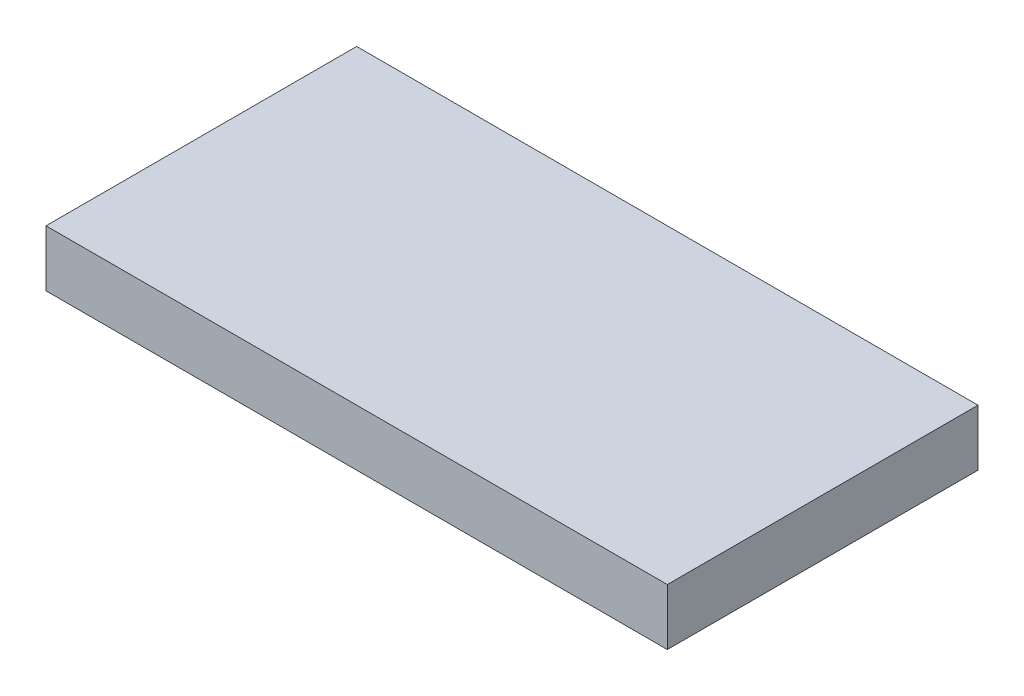
ISO-10303-21;
HEADER;
FILE_DESCRIPTION(('STEP AP214'),'2;1');
FILE_NAME('part.step','',(''),(''),'','','');
FILE_SCHEMA(('AUTOMOTIVE_DESIGN { 1 0 10303 214 1 1 1 1 }'));
ENDSEC;
DATA;
#1=APPLICATION_CONTEXT('core data for automotive mechanical design processes');
#2=APPLICATION_PROTOCOL_DEFINITION('international standard','automotive_design',2000,#1);
#3=PRODUCT_CONTEXT('',#1,'mechanical');
#4=PRODUCT('Part','Part','',(#3));
#5=PRODUCT_RELATED_PRODUCT_CATEGORY('part','',(#4));
#6=PRODUCT_DEFINITION_FORMATION('','',#4);
#7=PRODUCT_DEFINITION_CONTEXT('part definition',#1,'design');
#8=PRODUCT_DEFINITION('design','',#6,#7);
#9=PRODUCT_DEFINITION_SHAPE('','',#8);
#10=(LENGTH_UNIT() NAMED_UNIT(*) SI_UNIT(.MILLI.,.METRE.));
#11=(NAMED_UNIT(*) PLANE_ANGLE_UNIT() SI_UNIT($,.RADIAN.));
#12=(NAMED_UNIT(*) SI_UNIT($,.STERADIAN.) SOLID_ANGLE_UNIT());
#13=UNCERTAINTY_MEASURE_WITH_UNIT(LENGTH_MEASURE(1.E-05),#10,'distance_accuracy_value','');
#14=(GEOMETRIC_REPRESENTATION_CONTEXT(3) GLOBAL_UNCERTAINTY_ASSIGNED_CONTEXT((#13)) GLOBAL_UNIT_ASSIGNED_CONTEXT((#10,
#11,#12)) REPRESENTATION_CONTEXT('',''));
#15=CARTESIAN_POINT('',(0.,0.,0.));
#16=DIRECTION('',(0.,0.,1.));
#17=DIRECTION('',(1.,0.,0.));
#18=AXIS2_PLACEMENT_3D('',#15,#16,#17);
#19=CARTESIAN_POINT('',(0.,14.5,-80.));
#20=DIRECTION('',(0.,0.,-1.));
#21=DIRECTION('',(-1.,0.,0.));
#22=AXIS2_PLACEMENT_3D('',#19,#20,#21);
#23=PLANE('',#22);
#24=DIRECTION('',(1.,0.,0.));
#25=VECTOR('',#24,1.);
#26=CARTESIAN_POINT('',(0.,0.,-80.));
#27=LINE('',#26,#25);
#28=CARTESIAN_POINT('',(-80.,0.,-80.));
#29=VERTEX_POINT('',#28);
#30=CARTESIAN_POINT('',(80.,0.,-80.));
#31=VERTEX_POINT('',#30);
#32=EDGE_CURVE('E112',#29,#31,#27,.T.);
#33=ORIENTED_EDGE('',*,*,#32,.F.);
#34=DIRECTION('',(0.,-1.,0.));
#35=VECTOR('',#34,1.);
#36=CARTESIAN_POINT('',(-80.,14.5,-80.));
#37=LINE('',#36,#35);
#38=CARTESIAN_POINT('',(-80.,14.5,-80.));
#39=VERTEX_POINT('',#38);
#40=EDGE_CURVE('E115',#39,#29,#37,.T.);
#41=ORIENTED_EDGE('',*,*,#40,.F.);
#42=DIRECTION('',(1.,0.,0.));
#43=VECTOR('',#42,1.);
#44=CARTESIAN_POINT('',(0.,14.5,-80.));
#45=LINE('',#44,#43);
#46=CARTESIAN_POINT('',(80.,14.5,-80.));
#47=VERTEX_POINT('',#46);
#48=EDGE_CURVE('E134',#39,#47,#45,.T.);
#49=ORIENTED_EDGE('',*,*,#48,.T.);
#50=DIRECTION('',(0.,-1.,0.));
#51=VECTOR('',#50,1.);
#52=CARTESIAN_POINT('',(80.,14.5,-80.));
#53=LINE('',#52,#51);
#54=EDGE_CURVE('E78',#47,#31,#53,.T.);
#55=ORIENTED_EDGE('',*,*,#54,.T.);
#56=EDGE_LOOP('',(#33,#41,#49,#55));
#57=FACE_BOUND('',#56,.T.);
#58=ADVANCED_FACE('F68',(#57),#23,.T.);
#59=CARTESIAN_POINT('',(0.,0.,0.));
#60=DIRECTION('',(0.,1.,0.));
#61=DIRECTION('',(0.,0.,1.));
#62=AXIS2_PLACEMENT_3D('',#59,#60,#61);
#63=PLANE('',#62);
#64=CARTESIAN_POINT('',(-30.,0.,-15.));
#65=DIRECTION('',(0.,-1.,0.));
#66=DIRECTION('',(0.,0.,-1.));
#67=AXIS2_PLACEMENT_3D('',#64,#65,#66);
#68=CIRCLE('',#67,2.);
#69=CARTESIAN_POINT('',(-30.,0.,-17.));
#70=VERTEX_POINT('',#69);
#71=EDGE_CURVE('E131',#70,#70,#68,.T.);
#72=ORIENTED_EDGE('',*,*,#71,.F.);
#73=EDGE_LOOP('',(#72));
#74=FACE_BOUND('',#73,.T.);
#75=CARTESIAN_POINT('',(30.,0.,-15.));
#76=DIRECTION('',(0.,-1.,0.));
#77=DIRECTION('',(0.,0.,-1.));
#78=AXIS2_PLACEMENT_3D('',#75,#76,#77);
#79=CIRCLE('',#78,2.);
#80=CARTESIAN_POINT('',(30.,0.,-17.));
#81=VERTEX_POINT('',#80);
#82=EDGE_CURVE('E142',#81,#81,#79,.T.);
#83=ORIENTED_EDGE('',*,*,#82,.F.);
#84=EDGE_LOOP('',(#83));
#85=FACE_BOUND('',#84,.T.);
#86=DIRECTION('',(-1.,0.,0.));
#87=VECTOR('',#86,1.);
#88=CARTESIAN_POINT('',(0.,0.,0.));
#89=LINE('',#88,#87);
#90=CARTESIAN_POINT('',(80.,0.,0.));
#91=VERTEX_POINT('',#90);
#92=CARTESIAN_POINT('',(-80.,0.,0.));
#93=VERTEX_POINT('',#92);
#94=EDGE_CURVE('E106',#91,#93,#89,.T.);
#95=ORIENTED_EDGE('',*,*,#94,.T.);
#96=DIRECTION('',(0.,0.,-1.));
#97=VECTOR('',#96,1.);
#98=CARTESIAN_POINT('',(-80.,0.,0.));
#99=LINE('',#98,#97);
#100=EDGE_CURVE('E123',#93,#29,#99,.T.);
#101=ORIENTED_EDGE('',*,*,#100,.T.);
#102=ORIENTED_EDGE('',*,*,#32,.T.);
#103=DIRECTION('',(0.,0.,1.));
#104=VECTOR('',#103,1.);
#105=CARTESIAN_POINT('',(80.,0.,0.));
#106=LINE('',#105,#104);
#107=EDGE_CURVE('E118',#31,#91,#106,.T.);
#108=ORIENTED_EDGE('',*,*,#107,.T.);
#109=EDGE_LOOP('',(#95,#101,#102,#108));
#110=FACE_BOUND('',#109,.T.);
#111=ADVANCED_FACE('F126',(#74,#85,#110),#63,.F.);
#112=CARTESIAN_POINT('',(80.,14.5,0.));
#113=DIRECTION('',(1.,0.,0.));
#114=DIRECTION('',(0.,0.,-1.));
#115=AXIS2_PLACEMENT_3D('',#112,#113,#114);
#116=PLANE('',#115);
#117=ORIENTED_EDGE('',*,*,#107,.F.);
#118=ORIENTED_EDGE('',*,*,#54,.F.);
#119=DIRECTION('',(0.,0.,1.));
#120=VECTOR('',#119,1.);
#121=CARTESIAN_POINT('',(80.,14.5,0.));
#122=LINE('',#121,#120);
#123=CARTESIAN_POINT('',(80.,14.5,0.));
#124=VERTEX_POINT('',#123);
#125=EDGE_CURVE('E139',#47,#124,#122,.T.);
#126=ORIENTED_EDGE('',*,*,#125,.T.);
#127=DIRECTION('',(0.,-1.,0.));
#128=VECTOR('',#127,1.);
#129=CARTESIAN_POINT('',(80.,14.5,0.));
#130=LINE('',#129,#128);
#131=EDGE_CURVE('E12',#124,#91,#130,.T.);
#132=ORIENTED_EDGE('',*,*,#131,.T.);
#133=EDGE_LOOP('',(#117,#118,#126,#132));
#134=FACE_BOUND('',#133,.T.);
#135=ADVANCED_FACE('F155',(#134),#116,.T.);
#136=CARTESIAN_POINT('',(0.,14.5,0.));
#137=DIRECTION('',(0.,0.,1.));
#138=DIRECTION('',(1.,0.,0.));
#139=AXIS2_PLACEMENT_3D('',#136,#137,#138);
#140=PLANE('',#139);
#141=ORIENTED_EDGE('',*,*,#94,.F.);
#142=ORIENTED_EDGE('',*,*,#131,.F.);
#143=DIRECTION('',(-1.,0.,0.));
#144=VECTOR('',#143,1.);
#145=CARTESIAN_POINT('',(0.,14.5,0.));
#146=LINE('',#145,#144);
#147=CARTESIAN_POINT('',(-80.,14.5,0.));
#148=VERTEX_POINT('',#147);
#149=EDGE_CURVE('E117',#124,#148,#146,.T.);
#150=ORIENTED_EDGE('',*,*,#149,.T.);
#151=DIRECTION('',(0.,-1.,0.));
#152=VECTOR('',#151,1.);
#153=CARTESIAN_POINT('',(-80.,14.5,0.));
#154=LINE('',#153,#152);
#155=EDGE_CURVE('E72',#148,#93,#154,.T.);
#156=ORIENTED_EDGE('',*,*,#155,.T.);
#157=EDGE_LOOP('',(#141,#142,#150,#156));
#158=FACE_BOUND('',#157,.T.);
#159=ADVANCED_FACE('F175',(#158),#140,.T.);
#160=CARTESIAN_POINT('',(0.,14.5,0.));
#161=DIRECTION('',(0.,1.,0.));
#162=DIRECTION('',(0.,0.,1.));
#163=AXIS2_PLACEMENT_3D('',#160,#161,#162);
#164=PLANE('',#163);
#165=ORIENTED_EDGE('',*,*,#149,.F.);
#166=ORIENTED_EDGE('',*,*,#125,.F.);
#167=ORIENTED_EDGE('',*,*,#48,.F.);
#168=DIRECTION('',(0.,0.,-1.));
#169=VECTOR('',#168,1.);
#170=CARTESIAN_POINT('',(-80.,14.5,0.));
#171=LINE('',#170,#169);
#172=EDGE_CURVE('E125',#148,#39,#171,.T.);
#173=ORIENTED_EDGE('',*,*,#172,.F.);
#174=EDGE_LOOP('',(#165,#166,#167,#173));
#175=FACE_BOUND('',#174,.T.);
#176=ADVANCED_FACE('F170',(#175),#164,.T.);
#177=CARTESIAN_POINT('',(-80.,14.5,0.));
#178=DIRECTION('',(-1.,0.,0.));
#179=DIRECTION('',(0.,0.,1.));
#180=AXIS2_PLACEMENT_3D('',#177,#178,#179);
#181=PLANE('',#180);
#182=ORIENTED_EDGE('',*,*,#100,.F.);
#183=ORIENTED_EDGE('',*,*,#155,.F.);
#184=ORIENTED_EDGE('',*,*,#172,.T.);
#185=ORIENTED_EDGE('',*,*,#40,.T.);
#186=EDGE_LOOP('',(#182,#183,#184,#185));
#187=FACE_BOUND('',#186,.T.);
#188=ADVANCED_FACE('F70',(#187),#181,.T.);
#189=CARTESIAN_POINT('',(30.,10.,-15.));
#190=DIRECTION('',(0.,-1.,0.));
#191=DIRECTION('',(0.,0.,-1.));
#192=AXIS2_PLACEMENT_3D('',#189,#190,#191);
#193=CYLINDRICAL_SURFACE('',#192,2.);
#194=CARTESIAN_POINT('',(30.,10.,-15.));
#195=DIRECTION('',(0.,-1.,0.));
#196=DIRECTION('',(0.,0.,-1.));
#197=AXIS2_PLACEMENT_3D('',#194,#195,#196);
#198=CIRCLE('',#197,2.);
#199=CARTESIAN_POINT('',(30.,10.,-17.));
#200=VERTEX_POINT('',#199);
#201=EDGE_CURVE('E145',#200,#200,#198,.T.);
#202=ORIENTED_EDGE('',*,*,#201,.F.);
#203=EDGE_LOOP('',(#202));
#204=FACE_BOUND('',#203,.T.);
#205=ORIENTED_EDGE('',*,*,#82,.T.);
#206=EDGE_LOOP('',(#205));
#207=FACE_BOUND('',#206,.T.);
#208=ADVANCED_FACE('F159',(#204,#207),#193,.F.);
#209=CARTESIAN_POINT('',(0.,10.,0.));
#210=DIRECTION('',(0.,-1.,0.));
#211=DIRECTION('',(0.,0.,-1.));
#212=AXIS2_PLACEMENT_3D('',#209,#210,#211);
#213=PLANE('',#212);
#214=ORIENTED_EDGE('',*,*,#201,.T.);
#215=EDGE_LOOP('',(#214));
#216=FACE_BOUND('',#215,.T.);
#217=ADVANCED_FACE('F161',(#216),#213,.T.);
#218=CARTESIAN_POINT('',(-30.,10.,-15.));
#219=DIRECTION('',(0.,-1.,0.));
#220=DIRECTION('',(0.,0.,-1.));
#221=AXIS2_PLACEMENT_3D('',#218,#219,#220);
#222=CYLINDRICAL_SURFACE('',#221,2.);
#223=CARTESIAN_POINT('',(-30.,10.,-15.));
#224=DIRECTION('',(0.,-1.,0.));
#225=DIRECTION('',(0.,0.,-1.));
#226=AXIS2_PLACEMENT_3D('',#223,#224,#225);
#227=CIRCLE('',#226,2.);
#228=CARTESIAN_POINT('',(-30.,10.,-17.));
#229=VERTEX_POINT('',#228);
#230=EDGE_CURVE('E127',#229,#229,#227,.T.);
#231=ORIENTED_EDGE('',*,*,#230,.F.);
#232=EDGE_LOOP('',(#231));
#233=FACE_BOUND('',#232,.T.);
#234=ORIENTED_EDGE('',*,*,#71,.T.);
#235=EDGE_LOOP('',(#234));
#236=FACE_BOUND('',#235,.T.);
#237=ADVANCED_FACE('F151',(#233,#236),#222,.F.);
#238=CARTESIAN_POINT('',(0.,10.,0.));
#239=DIRECTION('',(0.,-1.,0.));
#240=DIRECTION('',(0.,0.,-1.));
#241=AXIS2_PLACEMENT_3D('',#238,#239,#240);
#242=PLANE('',#241);
#243=ORIENTED_EDGE('',*,*,#230,.T.);
#244=EDGE_LOOP('',(#243));
#245=FACE_BOUND('',#244,.T.);
#246=ADVANCED_FACE('F227',(#245),#242,.T.);
#247=CLOSED_SHELL('',(#58,#111,#135,#159,#176,#188,#208,#217,#237,#246));
#248=MANIFOLD_SOLID_BREP('B2',#247);
#249=ADVANCED_BREP_SHAPE_REPRESENTATION('',(#18,#248),#14);
#250=SHAPE_DEFINITION_REPRESENTATION(#9,#249);
ENDSEC;
END-ISO-10303-21;
